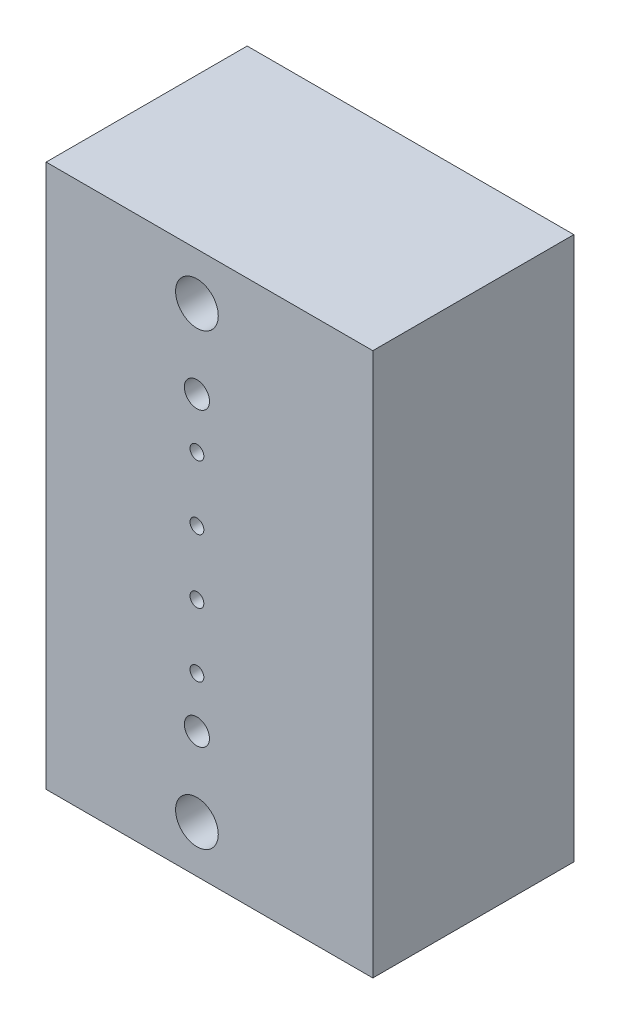
ISO-10303-21;
HEADER;
FILE_DESCRIPTION(('STEP AP214'),'2;1');
FILE_NAME('part.step','',(''),(''),'','','');
FILE_SCHEMA(('AUTOMOTIVE_DESIGN { 1 0 10303 214 1 1 1 1 }'));
ENDSEC;
DATA;
#1=APPLICATION_CONTEXT('core data for automotive mechanical design processes');
#2=APPLICATION_PROTOCOL_DEFINITION('international standard','automotive_design',2000,#1);
#3=PRODUCT_CONTEXT('',#1,'mechanical');
#4=PRODUCT('Part','Part','',(#3));
#5=PRODUCT_RELATED_PRODUCT_CATEGORY('part','',(#4));
#6=PRODUCT_DEFINITION_FORMATION('','',#4);
#7=PRODUCT_DEFINITION_CONTEXT('part definition',#1,'design');
#8=PRODUCT_DEFINITION('design','',#6,#7);
#9=PRODUCT_DEFINITION_SHAPE('','',#8);
#10=(LENGTH_UNIT() NAMED_UNIT(*) SI_UNIT(.MILLI.,.METRE.));
#11=(NAMED_UNIT(*) PLANE_ANGLE_UNIT() SI_UNIT($,.RADIAN.));
#12=(NAMED_UNIT(*) SI_UNIT($,.STERADIAN.) SOLID_ANGLE_UNIT());
#13=UNCERTAINTY_MEASURE_WITH_UNIT(LENGTH_MEASURE(1.E-05),#10,'distance_accuracy_value','');
#14=(GEOMETRIC_REPRESENTATION_CONTEXT(3) GLOBAL_UNCERTAINTY_ASSIGNED_CONTEXT((#13)) GLOBAL_UNIT_ASSIGNED_CONTEXT((#10,
#11,#12)) REPRESENTATION_CONTEXT('',''));
#15=CARTESIAN_POINT('',(0.,0.,0.));
#16=DIRECTION('',(0.,0.,1.));
#17=DIRECTION('',(1.,0.,0.));
#18=AXIS2_PLACEMENT_3D('',#15,#16,#17);
#19=CARTESIAN_POINT('',(-4.,26.62,16.));
#20=DIRECTION('',(1.,0.,0.));
#21=DIRECTION('',(0.,0.,-1.));
#22=AXIS2_PLACEMENT_3D('',#19,#20,#21);
#23=PLANE('',#22);
#24=DIRECTION('',(0.,0.,-1.));
#25=VECTOR('',#24,1.);
#26=CARTESIAN_POINT('',(-4.,-5.12,4.));
#27=LINE('',#26,#25);
#28=CARTESIAN_POINT('',(-4.,-5.12,4.));
#29=VERTEX_POINT('',#28);
#30=CARTESIAN_POINT('',(-4.,-5.12,0.));
#31=VERTEX_POINT('',#30);
#32=EDGE_CURVE('E123',#29,#31,#27,.T.);
#33=ORIENTED_EDGE('',*,*,#32,.T.);
#34=DIRECTION('',(0.,-1.,0.));
#35=VECTOR('',#34,1.);
#36=CARTESIAN_POINT('',(-4.,26.62,0.));
#37=LINE('',#36,#35);
#38=CARTESIAN_POINT('',(-4.,-16.62,0.));
#39=VERTEX_POINT('',#38);
#40=EDGE_CURVE('E189',#31,#39,#37,.T.);
#41=ORIENTED_EDGE('',*,*,#40,.T.);
#42=DIRECTION('',(0.,0.,-1.));
#43=VECTOR('',#42,1.);
#44=CARTESIAN_POINT('',(-4.,-16.62,16.));
#45=LINE('',#44,#43);
#46=CARTESIAN_POINT('',(-4.,-16.62,16.));
#47=VERTEX_POINT('',#46);
#48=EDGE_CURVE('E11',#47,#39,#45,.T.);
#49=ORIENTED_EDGE('',*,*,#48,.F.);
#50=DIRECTION('',(0.,-1.,0.));
#51=VECTOR('',#50,1.);
#52=CARTESIAN_POINT('',(-4.,26.62,16.));
#53=LINE('',#52,#51);
#54=CARTESIAN_POINT('',(-4.,26.62,16.));
#55=VERTEX_POINT('',#54);
#56=EDGE_CURVE('E179',#55,#47,#53,.T.);
#57=ORIENTED_EDGE('',*,*,#56,.F.);
#58=DIRECTION('',(0.,0.,-1.));
#59=VECTOR('',#58,1.);
#60=CARTESIAN_POINT('',(-4.,26.62,16.));
#61=LINE('',#60,#59);
#62=CARTESIAN_POINT('',(-4.,26.62,0.));
#63=VERTEX_POINT('',#62);
#64=EDGE_CURVE('E185',#55,#63,#61,.T.);
#65=ORIENTED_EDGE('',*,*,#64,.T.);
#66=CARTESIAN_POINT('',(-4.,15.12,0.));
#67=VERTEX_POINT('',#66);
#68=EDGE_CURVE('E186',#63,#67,#37,.T.);
#69=ORIENTED_EDGE('',*,*,#68,.T.);
#70=DIRECTION('',(0.,0.,-1.));
#71=VECTOR('',#70,1.);
#72=CARTESIAN_POINT('',(-4.,15.12,4.));
#73=LINE('',#72,#71);
#74=CARTESIAN_POINT('',(-4.,15.12,4.));
#75=VERTEX_POINT('',#74);
#76=EDGE_CURVE('E51',#75,#67,#73,.T.);
#77=ORIENTED_EDGE('',*,*,#76,.F.);
#78=DIRECTION('',(0.,-1.,0.));
#79=VECTOR('',#78,1.);
#80=CARTESIAN_POINT('',(-4.,15.12,4.));
#81=LINE('',#80,#79);
#82=EDGE_CURVE('E117',#75,#29,#81,.T.);
#83=ORIENTED_EDGE('',*,*,#82,.T.);
#84=EDGE_LOOP('',(#33,#41,#49,#57,#65,#69,#77,#83));
#85=FACE_BOUND('',#84,.T.);
#86=ADVANCED_FACE('F35',(#85),#23,.F.);
#87=CARTESIAN_POINT('',(0.,0.,0.));
#88=DIRECTION('',(0.,0.,1.));
#89=DIRECTION('',(1.,0.,0.));
#90=AXIS2_PLACEMENT_3D('',#87,#88,#89);
#91=PLANE('',#90);
#92=CARTESIAN_POINT('',(8.,-12.87,0.));
#93=DIRECTION('',(0.,0.,1.));
#94=DIRECTION('',(1.,0.,0.));
#95=AXIS2_PLACEMENT_3D('',#92,#93,#94);
#96=CIRCLE('',#95,1.7);
#97=CARTESIAN_POINT('',(9.7,-12.87,0.));
#98=VERTEX_POINT('',#97);
#99=EDGE_CURVE('E178',#98,#98,#96,.T.);
#100=ORIENTED_EDGE('',*,*,#99,.T.);
#101=EDGE_LOOP('',(#100));
#102=FACE_BOUND('',#101,.T.);
#103=CARTESIAN_POINT('',(8.,22.87,0.));
#104=DIRECTION('',(0.,0.,1.));
#105=DIRECTION('',(1.,0.,0.));
#106=AXIS2_PLACEMENT_3D('',#103,#104,#105);
#107=CIRCLE('',#106,1.7);
#108=CARTESIAN_POINT('',(9.7,22.87,0.));
#109=VERTEX_POINT('',#108);
#110=EDGE_CURVE('E200',#109,#109,#107,.T.);
#111=ORIENTED_EDGE('',*,*,#110,.T.);
#112=EDGE_LOOP('',(#111));
#113=FACE_BOUND('',#112,.T.);
#114=DIRECTION('',(1.,0.,0.));
#115=VECTOR('',#114,1.);
#116=CARTESIAN_POINT('',(-4.,-5.12,0.));
#117=LINE('',#116,#115);
#118=CARTESIAN_POINT('',(10.5,-5.12,0.));
#119=VERTEX_POINT('',#118);
#120=EDGE_CURVE('E126',#31,#119,#117,.T.);
#121=ORIENTED_EDGE('',*,*,#120,.T.);
#122=DIRECTION('',(0.,1.,0.));
#123=VECTOR('',#122,1.);
#124=CARTESIAN_POINT('',(10.5,-5.12,0.));
#125=LINE('',#124,#123);
#126=CARTESIAN_POINT('',(10.5,15.12,0.));
#127=VERTEX_POINT('',#126);
#128=EDGE_CURVE('E134',#119,#127,#125,.T.);
#129=ORIENTED_EDGE('',*,*,#128,.T.);
#130=DIRECTION('',(-1.,0.,0.));
#131=VECTOR('',#130,1.);
#132=CARTESIAN_POINT('',(10.5,15.12,0.));
#133=LINE('',#132,#131);
#134=EDGE_CURVE('E132',#127,#67,#133,.T.);
#135=ORIENTED_EDGE('',*,*,#134,.T.);
#136=ORIENTED_EDGE('',*,*,#68,.F.);
#137=DIRECTION('',(-1.,0.,0.));
#138=VECTOR('',#137,1.);
#139=CARTESIAN_POINT('',(22.,26.62,0.));
#140=LINE('',#139,#138);
#141=CARTESIAN_POINT('',(22.,26.62,0.));
#142=VERTEX_POINT('',#141);
#143=EDGE_CURVE('E81',#142,#63,#140,.T.);
#144=ORIENTED_EDGE('',*,*,#143,.F.);
#145=DIRECTION('',(0.,1.,0.));
#146=VECTOR('',#145,1.);
#147=CARTESIAN_POINT('',(22.,-16.62,0.));
#148=LINE('',#147,#146);
#149=CARTESIAN_POINT('',(22.,-16.62,0.));
#150=VERTEX_POINT('',#149);
#151=EDGE_CURVE('E191',#150,#142,#148,.T.);
#152=ORIENTED_EDGE('',*,*,#151,.F.);
#153=DIRECTION('',(1.,0.,0.));
#154=VECTOR('',#153,1.);
#155=CARTESIAN_POINT('',(-4.,-16.62,0.));
#156=LINE('',#155,#154);
#157=EDGE_CURVE('E188',#39,#150,#156,.T.);
#158=ORIENTED_EDGE('',*,*,#157,.F.);
#159=ORIENTED_EDGE('',*,*,#40,.F.);
#160=EDGE_LOOP('',(#121,#129,#135,#136,#144,#152,#158,#159));
#161=FACE_BOUND('',#160,.T.);
#162=ADVANCED_FACE('F209',(#102,#113,#161),#91,.F.);
#163=CARTESIAN_POINT('',(-4.,-16.62,16.));
#164=DIRECTION('',(0.,1.,0.));
#165=DIRECTION('',(0.,0.,1.));
#166=AXIS2_PLACEMENT_3D('',#163,#164,#165);
#167=PLANE('',#166);
#168=ORIENTED_EDGE('',*,*,#157,.T.);
#169=DIRECTION('',(0.,0.,-1.));
#170=VECTOR('',#169,1.);
#171=CARTESIAN_POINT('',(22.,-16.62,16.));
#172=LINE('',#171,#170);
#173=CARTESIAN_POINT('',(22.,-16.62,16.));
#174=VERTEX_POINT('',#173);
#175=EDGE_CURVE('E43',#174,#150,#172,.T.);
#176=ORIENTED_EDGE('',*,*,#175,.F.);
#177=DIRECTION('',(1.,0.,0.));
#178=VECTOR('',#177,1.);
#179=CARTESIAN_POINT('',(-4.,-16.62,16.));
#180=LINE('',#179,#178);
#181=EDGE_CURVE('E88',#47,#174,#180,.T.);
#182=ORIENTED_EDGE('',*,*,#181,.F.);
#183=ORIENTED_EDGE('',*,*,#48,.T.);
#184=EDGE_LOOP('',(#168,#176,#182,#183));
#185=FACE_BOUND('',#184,.T.);
#186=ADVANCED_FACE('F210',(#185),#167,.F.);
#187=CARTESIAN_POINT('',(22.,-16.62,16.));
#188=DIRECTION('',(-1.,0.,0.));
#189=DIRECTION('',(0.,0.,1.));
#190=AXIS2_PLACEMENT_3D('',#187,#188,#189);
#191=PLANE('',#190);
#192=ORIENTED_EDGE('',*,*,#151,.T.);
#193=DIRECTION('',(0.,0.,-1.));
#194=VECTOR('',#193,1.);
#195=CARTESIAN_POINT('',(22.,26.62,16.));
#196=LINE('',#195,#194);
#197=CARTESIAN_POINT('',(22.,26.62,16.));
#198=VERTEX_POINT('',#197);
#199=EDGE_CURVE('E195',#198,#142,#196,.T.);
#200=ORIENTED_EDGE('',*,*,#199,.F.);
#201=DIRECTION('',(0.,1.,0.));
#202=VECTOR('',#201,1.);
#203=CARTESIAN_POINT('',(22.,-16.62,16.));
#204=LINE('',#203,#202);
#205=EDGE_CURVE('E182',#174,#198,#204,.T.);
#206=ORIENTED_EDGE('',*,*,#205,.F.);
#207=ORIENTED_EDGE('',*,*,#175,.T.);
#208=EDGE_LOOP('',(#192,#200,#206,#207));
#209=FACE_BOUND('',#208,.T.);
#210=ADVANCED_FACE('F212',(#209),#191,.F.);
#211=CARTESIAN_POINT('',(22.,26.62,16.));
#212=DIRECTION('',(0.,-1.,0.));
#213=DIRECTION('',(0.,0.,-1.));
#214=AXIS2_PLACEMENT_3D('',#211,#212,#213);
#215=PLANE('',#214);
#216=ORIENTED_EDGE('',*,*,#143,.T.);
#217=ORIENTED_EDGE('',*,*,#64,.F.);
#218=DIRECTION('',(-1.,0.,0.));
#219=VECTOR('',#218,1.);
#220=CARTESIAN_POINT('',(22.,26.62,16.));
#221=LINE('',#220,#219);
#222=EDGE_CURVE('E60',#198,#55,#221,.T.);
#223=ORIENTED_EDGE('',*,*,#222,.F.);
#224=ORIENTED_EDGE('',*,*,#199,.T.);
#225=EDGE_LOOP('',(#216,#217,#223,#224));
#226=FACE_BOUND('',#225,.T.);
#227=ADVANCED_FACE('F217',(#226),#215,.F.);
#228=CARTESIAN_POINT('',(0.,0.,16.));
#229=DIRECTION('',(0.,0.,1.));
#230=DIRECTION('',(1.,0.,0.));
#231=AXIS2_PLACEMENT_3D('',#228,#229,#230);
#232=PLANE('',#231);
#233=CARTESIAN_POINT('',(8.,-6.62,16.));
#234=DIRECTION('',(0.,0.,1.));
#235=DIRECTION('',(1.,0.,0.));
#236=AXIS2_PLACEMENT_3D('',#233,#234,#235);
#237=CIRCLE('',#236,1.);
#238=CARTESIAN_POINT('',(9.,-6.62,16.));
#239=VERTEX_POINT('',#238);
#240=EDGE_CURVE('E423',#239,#239,#237,.T.);
#241=ORIENTED_EDGE('',*,*,#240,.F.);
#242=EDGE_LOOP('',(#241));
#243=FACE_BOUND('',#242,.T.);
#244=CARTESIAN_POINT('',(8.,16.62,16.));
#245=DIRECTION('',(0.,0.,1.));
#246=DIRECTION('',(1.,0.,0.));
#247=AXIS2_PLACEMENT_3D('',#244,#245,#246);
#248=CIRCLE('',#247,1.);
#249=CARTESIAN_POINT('',(9.,16.62,16.));
#250=VERTEX_POINT('',#249);
#251=EDGE_CURVE('E137',#250,#250,#248,.T.);
#252=ORIENTED_EDGE('',*,*,#251,.F.);
#253=EDGE_LOOP('',(#252));
#254=FACE_BOUND('',#253,.T.);
#255=CARTESIAN_POINT('',(8.,22.87,16.));
#256=DIRECTION('',(0.,0.,1.));
#257=DIRECTION('',(1.,0.,0.));
#258=AXIS2_PLACEMENT_3D('',#255,#256,#257);
#259=CIRCLE('',#258,1.7);
#260=CARTESIAN_POINT('',(9.7,22.87,16.));
#261=VERTEX_POINT('',#260);
#262=EDGE_CURVE('E160',#261,#261,#259,.T.);
#263=ORIENTED_EDGE('',*,*,#262,.F.);
#264=EDGE_LOOP('',(#263));
#265=FACE_BOUND('',#264,.T.);
#266=CARTESIAN_POINT('',(8.,2.46,16.));
#267=DIRECTION('',(0.,0.,1.));
#268=DIRECTION('',(1.,0.,0.));
#269=AXIS2_PLACEMENT_3D('',#266,#267,#268);
#270=CIRCLE('',#269,0.55);
#271=CARTESIAN_POINT('',(8.55,2.46,16.));
#272=VERTEX_POINT('',#271);
#273=EDGE_CURVE('E168',#272,#272,#270,.T.);
#274=ORIENTED_EDGE('',*,*,#273,.F.);
#275=EDGE_LOOP('',(#274));
#276=FACE_BOUND('',#275,.T.);
#277=CARTESIAN_POINT('',(8.,7.54,16.));
#278=DIRECTION('',(0.,0.,1.));
#279=DIRECTION('',(1.,0.,0.));
#280=AXIS2_PLACEMENT_3D('',#277,#278,#279);
#281=CIRCLE('',#280,0.55);
#282=CARTESIAN_POINT('',(8.55,7.54,16.));
#283=VERTEX_POINT('',#282);
#284=EDGE_CURVE('E164',#283,#283,#281,.T.);
#285=ORIENTED_EDGE('',*,*,#284,.F.);
#286=EDGE_LOOP('',(#285));
#287=FACE_BOUND('',#286,.T.);
#288=CARTESIAN_POINT('',(8.,12.62,16.));
#289=DIRECTION('',(0.,0.,1.));
#290=DIRECTION('',(1.,0.,0.));
#291=AXIS2_PLACEMENT_3D('',#288,#289,#290);
#292=CIRCLE('',#291,0.55);
#293=CARTESIAN_POINT('',(8.55,12.62,16.));
#294=VERTEX_POINT('',#293);
#295=EDGE_CURVE('E161',#294,#294,#292,.T.);
#296=ORIENTED_EDGE('',*,*,#295,.F.);
#297=EDGE_LOOP('',(#296));
#298=FACE_BOUND('',#297,.T.);
#299=CARTESIAN_POINT('',(8.,-12.87,16.));
#300=DIRECTION('',(0.,0.,1.));
#301=DIRECTION('',(1.,0.,0.));
#302=AXIS2_PLACEMENT_3D('',#299,#300,#301);
#303=CIRCLE('',#302,1.7);
#304=CARTESIAN_POINT('',(9.7,-12.87,16.));
#305=VERTEX_POINT('',#304);
#306=EDGE_CURVE('E165',#305,#305,#303,.T.);
#307=ORIENTED_EDGE('',*,*,#306,.F.);
#308=EDGE_LOOP('',(#307));
#309=FACE_BOUND('',#308,.T.);
#310=CARTESIAN_POINT('',(8.,-2.62,16.));
#311=DIRECTION('',(0.,0.,1.));
#312=DIRECTION('',(1.,0.,0.));
#313=AXIS2_PLACEMENT_3D('',#310,#311,#312);
#314=CIRCLE('',#313,0.55);
#315=CARTESIAN_POINT('',(8.55,-2.62,16.));
#316=VERTEX_POINT('',#315);
#317=EDGE_CURVE('E171',#316,#316,#314,.T.);
#318=ORIENTED_EDGE('',*,*,#317,.F.);
#319=EDGE_LOOP('',(#318));
#320=FACE_BOUND('',#319,.T.);
#321=ORIENTED_EDGE('',*,*,#56,.T.);
#322=ORIENTED_EDGE('',*,*,#181,.T.);
#323=ORIENTED_EDGE('',*,*,#205,.T.);
#324=ORIENTED_EDGE('',*,*,#222,.T.);
#325=EDGE_LOOP('',(#321,#322,#323,#324));
#326=FACE_BOUND('',#325,.T.);
#327=ADVANCED_FACE('F242',(#243,#254,#265,#276,#287,#298,#309,#320,#326),#232,.T.);
#328=CARTESIAN_POINT('',(8.,-2.62,-1.2E-05));
#329=DIRECTION('',(0.,0.,1.));
#330=DIRECTION('',(1.,0.,0.));
#331=AXIS2_PLACEMENT_3D('',#328,#329,#330);
#332=CYLINDRICAL_SURFACE('',#331,0.55);
#333=CARTESIAN_POINT('',(8.,-2.62,4.));
#334=DIRECTION('',(0.,0.,1.));
#335=DIRECTION('',(1.,0.,0.));
#336=AXIS2_PLACEMENT_3D('',#333,#334,#335);
#337=CIRCLE('',#336,0.55);
#338=CARTESIAN_POINT('',(8.55,-2.62,4.));
#339=VERTEX_POINT('',#338);
#340=EDGE_CURVE('E157',#339,#339,#337,.F.);
#341=ORIENTED_EDGE('',*,*,#340,.T.);
#342=EDGE_LOOP('',(#341));
#343=FACE_BOUND('',#342,.T.);
#344=ORIENTED_EDGE('',*,*,#317,.T.);
#345=EDGE_LOOP('',(#344));
#346=FACE_BOUND('',#345,.T.);
#347=ADVANCED_FACE('F236',(#343,#346),#332,.F.);
#348=CARTESIAN_POINT('',(8.,-12.87,-1.2E-05));
#349=DIRECTION('',(0.,0.,1.));
#350=DIRECTION('',(1.,0.,0.));
#351=AXIS2_PLACEMENT_3D('',#348,#349,#350);
#352=CYLINDRICAL_SURFACE('',#351,1.7);
#353=CARTESIAN_POINT('',(9.7,-12.87,16.));
#354=CARTESIAN_POINT('',(9.7,-12.87,15.8333333333333));
#355=CARTESIAN_POINT('',(9.7,-12.87,15.6666666666667));
#356=CARTESIAN_POINT('',(9.7,-12.87,15.3333333333333));
#357=CARTESIAN_POINT('',(9.7,-12.87,15.1666666666667));
#358=CARTESIAN_POINT('',(9.7,-12.87,14.8333333333333));
#359=CARTESIAN_POINT('',(9.7,-12.87,14.6666666666667));
#360=CARTESIAN_POINT('',(9.7,-12.87,14.3333333333333));
#361=CARTESIAN_POINT('',(9.7,-12.87,14.1666666666667));
#362=CARTESIAN_POINT('',(9.7,-12.87,13.8333333333333));
#363=CARTESIAN_POINT('',(9.7,-12.87,13.6666666666667));
#364=CARTESIAN_POINT('',(9.7,-12.87,13.3333333333333));
#365=CARTESIAN_POINT('',(9.7,-12.87,13.1666666666667));
#366=CARTESIAN_POINT('',(9.7,-12.87,12.8333333333333));
#367=CARTESIAN_POINT('',(9.7,-12.87,12.6666666666667));
#368=CARTESIAN_POINT('',(9.7,-12.87,12.3333333333333));
#369=CARTESIAN_POINT('',(9.7,-12.87,12.1666666666667));
#370=CARTESIAN_POINT('',(9.7,-12.87,11.8333333333333));
#371=CARTESIAN_POINT('',(9.7,-12.87,11.6666666666667));
#372=CARTESIAN_POINT('',(9.7,-12.87,11.3333333333333));
#373=CARTESIAN_POINT('',(9.7,-12.87,11.1666666666667));
#374=CARTESIAN_POINT('',(9.7,-12.87,10.8333333333333));
#375=CARTESIAN_POINT('',(9.7,-12.87,10.6666666666667));
#376=CARTESIAN_POINT('',(9.7,-12.87,10.3333333333333));
#377=CARTESIAN_POINT('',(9.7,-12.87,10.1666666666667));
#378=CARTESIAN_POINT('',(9.7,-12.87,9.83333333333333));
#379=CARTESIAN_POINT('',(9.7,-12.87,9.66666666666667));
#380=CARTESIAN_POINT('',(9.7,-12.87,9.33333333333333));
#381=CARTESIAN_POINT('',(9.7,-12.87,9.16666666666666));
#382=CARTESIAN_POINT('',(9.7,-12.87,8.83333333333333));
#383=CARTESIAN_POINT('',(9.7,-12.87,8.66666666666667));
#384=CARTESIAN_POINT('',(9.7,-12.87,8.33333333333333));
#385=CARTESIAN_POINT('',(9.7,-12.87,8.16666666666667));
#386=CARTESIAN_POINT('',(9.7,-12.87,7.83333333333333));
#387=CARTESIAN_POINT('',(9.7,-12.87,7.66666666666667));
#388=CARTESIAN_POINT('',(9.7,-12.87,7.33333333333333));
#389=CARTESIAN_POINT('',(9.7,-12.87,7.16666666666667));
#390=CARTESIAN_POINT('',(9.7,-12.87,6.83333333333333));
#391=CARTESIAN_POINT('',(9.7,-12.87,6.66666666666667));
#392=CARTESIAN_POINT('',(9.7,-12.87,6.33333333333333));
#393=CARTESIAN_POINT('',(9.7,-12.87,6.16666666666667));
#394=CARTESIAN_POINT('',(9.7,-12.87,5.83333333333333));
#395=CARTESIAN_POINT('',(9.7,-12.87,5.66666666666667));
#396=CARTESIAN_POINT('',(9.7,-12.87,5.33333333333333));
#397=CARTESIAN_POINT('',(9.7,-12.87,5.16666666666667));
#398=CARTESIAN_POINT('',(9.7,-12.87,4.83333333333333));
#399=CARTESIAN_POINT('',(9.7,-12.87,4.66666666666667));
#400=CARTESIAN_POINT('',(9.7,-12.87,4.33333333333333));
#401=CARTESIAN_POINT('',(9.7,-12.87,4.16666666666667));
#402=CARTESIAN_POINT('',(9.7,-12.87,3.83333333333333));
#403=CARTESIAN_POINT('',(9.7,-12.87,3.66666666666667));
#404=CARTESIAN_POINT('',(9.7,-12.87,3.33333333333333));
#405=CARTESIAN_POINT('',(9.7,-12.87,3.16666666666667));
#406=CARTESIAN_POINT('',(9.7,-12.87,2.83333333333333));
#407=CARTESIAN_POINT('',(9.7,-12.87,2.66666666666667));
#408=CARTESIAN_POINT('',(9.7,-12.87,2.33333333333333));
#409=CARTESIAN_POINT('',(9.7,-12.87,2.16666666666667));
#410=CARTESIAN_POINT('',(9.7,-12.87,1.83333333333333));
#411=CARTESIAN_POINT('',(9.7,-12.87,1.66666666666667));
#412=CARTESIAN_POINT('',(9.7,-12.87,1.33333333333333));
#413=CARTESIAN_POINT('',(9.7,-12.87,1.16666666666667));
#414=CARTESIAN_POINT('',(9.7,-12.87,0.833333333333335));
#415=CARTESIAN_POINT('',(9.7,-12.87,0.666666666666668));
#416=CARTESIAN_POINT('',(9.7,-12.87,0.333333333333334));
#417=CARTESIAN_POINT('',(9.7,-12.87,0.166666666666667));
#418=CARTESIAN_POINT('',(9.7,-12.87,0.));
#419=B_SPLINE_CURVE_WITH_KNOTS('',3,(#353,#354,#355,#356,#357,#358,#359,#360,#361,#362,#363,
#364,#365,#366,#367,#368,#369,#370,#371,#372,#373,#374,#375,#376,#377,#378,#379,#380,#381,#382,
#383,#384,#385,#386,#387,#388,#389,#390,#391,#392,#393,#394,#395,#396,#397,#398,#399,#400,#401,
#402,#403,#404,#405,#406,#407,#408,#409,#410,#411,#412,#413,#414,#415,#416,#417,#418),
.UNSPECIFIED.,.F.,.F.,(4,2,2,2,2,2,2,2,2,2,2,2,2,2,2,2,2,2,2,2,2,2,2,2,2,2,2,2,2,2,2,2,4),(0.,
0.499999999999999,0.999999999999999,1.5,2.,2.5,3.,3.5,4.,4.5,5.,5.5,6.,6.5,7.,7.5,8.,8.5,9.,9.5,
10.,10.5,11.,11.5,12.,12.5,13.,13.5,14.,14.5,15.,15.5,16.),.UNSPECIFIED.);
#420=EDGE_CURVE('BSEAM241',#305,#98,#419,.T.);
#421=ORIENTED_EDGE('',*,*,#306,.T.);
#422=ORIENTED_EDGE('',*,*,#99,.F.);
#423=ORIENTED_EDGE('',*,*,#420,.T.);
#424=ORIENTED_EDGE('',*,*,#420,.F.);
#425=EDGE_LOOP('',(#421,#423,#422,#424));
#426=FACE_BOUND('',#425,.T.);
#427=ADVANCED_FACE('F241',(#426),#352,.F.);
#428=CARTESIAN_POINT('',(8.,12.62,-1.2E-05));
#429=DIRECTION('',(0.,0.,1.));
#430=DIRECTION('',(1.,0.,0.));
#431=AXIS2_PLACEMENT_3D('',#428,#429,#430);
#432=CYLINDRICAL_SURFACE('',#431,0.55);
#433=CARTESIAN_POINT('',(8.,12.62,4.));
#434=DIRECTION('',(0.,0.,1.));
#435=DIRECTION('',(1.,0.,0.));
#436=AXIS2_PLACEMENT_3D('',#433,#434,#435);
#437=CIRCLE('',#436,0.55);
#438=CARTESIAN_POINT('',(8.55,12.62,4.));
#439=VERTEX_POINT('',#438);
#440=EDGE_CURVE('E154',#439,#439,#437,.F.);
#441=ORIENTED_EDGE('',*,*,#440,.T.);
#442=EDGE_LOOP('',(#441));
#443=FACE_BOUND('',#442,.T.);
#444=ORIENTED_EDGE('',*,*,#295,.T.);
#445=EDGE_LOOP('',(#444));
#446=FACE_BOUND('',#445,.T.);
#447=ADVANCED_FACE('F252',(#443,#446),#432,.F.);
#448=CARTESIAN_POINT('',(8.,7.54,-1.2E-05));
#449=DIRECTION('',(0.,0.,1.));
#450=DIRECTION('',(1.,0.,0.));
#451=AXIS2_PLACEMENT_3D('',#448,#449,#450);
#452=CYLINDRICAL_SURFACE('',#451,0.55);
#453=CARTESIAN_POINT('',(8.,7.54,4.));
#454=DIRECTION('',(0.,0.,1.));
#455=DIRECTION('',(1.,0.,0.));
#456=AXIS2_PLACEMENT_3D('',#453,#454,#455);
#457=CIRCLE('',#456,0.55);
#458=CARTESIAN_POINT('',(8.55,7.54,4.));
#459=VERTEX_POINT('',#458);
#460=EDGE_CURVE('E151',#459,#459,#457,.F.);
#461=ORIENTED_EDGE('',*,*,#460,.T.);
#462=EDGE_LOOP('',(#461));
#463=FACE_BOUND('',#462,.T.);
#464=ORIENTED_EDGE('',*,*,#284,.T.);
#465=EDGE_LOOP('',(#464));
#466=FACE_BOUND('',#465,.T.);
#467=ADVANCED_FACE('F257',(#463,#466),#452,.F.);
#468=CARTESIAN_POINT('',(8.,2.46,-1.2E-05));
#469=DIRECTION('',(0.,0.,1.));
#470=DIRECTION('',(1.,0.,0.));
#471=AXIS2_PLACEMENT_3D('',#468,#469,#470);
#472=CYLINDRICAL_SURFACE('',#471,0.55);
#473=CARTESIAN_POINT('',(8.,2.46,4.));
#474=DIRECTION('',(0.,0.,1.));
#475=DIRECTION('',(1.,0.,0.));
#476=AXIS2_PLACEMENT_3D('',#473,#474,#475);
#477=CIRCLE('',#476,0.55);
#478=CARTESIAN_POINT('',(8.55,2.46,4.));
#479=VERTEX_POINT('',#478);
#480=EDGE_CURVE('E38',#479,#479,#477,.F.);
#481=ORIENTED_EDGE('',*,*,#480,.T.);
#482=EDGE_LOOP('',(#481));
#483=FACE_BOUND('',#482,.T.);
#484=ORIENTED_EDGE('',*,*,#273,.T.);
#485=EDGE_LOOP('',(#484));
#486=FACE_BOUND('',#485,.T.);
#487=ADVANCED_FACE('F267',(#483,#486),#472,.F.);
#488=CARTESIAN_POINT('',(8.,22.87,-1.2E-05));
#489=DIRECTION('',(0.,0.,1.));
#490=DIRECTION('',(1.,0.,0.));
#491=AXIS2_PLACEMENT_3D('',#488,#489,#490);
#492=CYLINDRICAL_SURFACE('',#491,1.7);
#493=CARTESIAN_POINT('',(9.7,22.87,16.));
#494=CARTESIAN_POINT('',(9.7,22.87,15.8333333333333));
#495=CARTESIAN_POINT('',(9.7,22.87,15.6666666666667));
#496=CARTESIAN_POINT('',(9.7,22.87,15.3333333333333));
#497=CARTESIAN_POINT('',(9.7,22.87,15.1666666666667));
#498=CARTESIAN_POINT('',(9.7,22.87,14.8333333333333));
#499=CARTESIAN_POINT('',(9.7,22.87,14.6666666666667));
#500=CARTESIAN_POINT('',(9.7,22.87,14.3333333333333));
#501=CARTESIAN_POINT('',(9.7,22.87,14.1666666666667));
#502=CARTESIAN_POINT('',(9.7,22.87,13.8333333333333));
#503=CARTESIAN_POINT('',(9.7,22.87,13.6666666666667));
#504=CARTESIAN_POINT('',(9.7,22.87,13.3333333333333));
#505=CARTESIAN_POINT('',(9.7,22.87,13.1666666666667));
#506=CARTESIAN_POINT('',(9.7,22.87,12.8333333333333));
#507=CARTESIAN_POINT('',(9.7,22.87,12.6666666666667));
#508=CARTESIAN_POINT('',(9.7,22.87,12.3333333333333));
#509=CARTESIAN_POINT('',(9.7,22.87,12.1666666666667));
#510=CARTESIAN_POINT('',(9.7,22.87,11.8333333333333));
#511=CARTESIAN_POINT('',(9.7,22.87,11.6666666666667));
#512=CARTESIAN_POINT('',(9.7,22.87,11.3333333333333));
#513=CARTESIAN_POINT('',(9.7,22.87,11.1666666666667));
#514=CARTESIAN_POINT('',(9.7,22.87,10.8333333333333));
#515=CARTESIAN_POINT('',(9.7,22.87,10.6666666666667));
#516=CARTESIAN_POINT('',(9.7,22.87,10.3333333333333));
#517=CARTESIAN_POINT('',(9.7,22.87,10.1666666666667));
#518=CARTESIAN_POINT('',(9.7,22.87,9.83333333333333));
#519=CARTESIAN_POINT('',(9.7,22.87,9.66666666666667));
#520=CARTESIAN_POINT('',(9.7,22.87,9.33333333333333));
#521=CARTESIAN_POINT('',(9.7,22.87,9.16666666666666));
#522=CARTESIAN_POINT('',(9.7,22.87,8.83333333333333));
#523=CARTESIAN_POINT('',(9.7,22.87,8.66666666666667));
#524=CARTESIAN_POINT('',(9.7,22.87,8.33333333333333));
#525=CARTESIAN_POINT('',(9.7,22.87,8.16666666666667));
#526=CARTESIAN_POINT('',(9.7,22.87,7.83333333333333));
#527=CARTESIAN_POINT('',(9.7,22.87,7.66666666666667));
#528=CARTESIAN_POINT('',(9.7,22.87,7.33333333333333));
#529=CARTESIAN_POINT('',(9.7,22.87,7.16666666666667));
#530=CARTESIAN_POINT('',(9.7,22.87,6.83333333333333));
#531=CARTESIAN_POINT('',(9.7,22.87,6.66666666666667));
#532=CARTESIAN_POINT('',(9.7,22.87,6.33333333333333));
#533=CARTESIAN_POINT('',(9.7,22.87,6.16666666666667));
#534=CARTESIAN_POINT('',(9.7,22.87,5.83333333333333));
#535=CARTESIAN_POINT('',(9.7,22.87,5.66666666666667));
#536=CARTESIAN_POINT('',(9.7,22.87,5.33333333333333));
#537=CARTESIAN_POINT('',(9.7,22.87,5.16666666666667));
#538=CARTESIAN_POINT('',(9.7,22.87,4.83333333333333));
#539=CARTESIAN_POINT('',(9.7,22.87,4.66666666666667));
#540=CARTESIAN_POINT('',(9.7,22.87,4.33333333333333));
#541=CARTESIAN_POINT('',(9.7,22.87,4.16666666666667));
#542=CARTESIAN_POINT('',(9.7,22.87,3.83333333333333));
#543=CARTESIAN_POINT('',(9.7,22.87,3.66666666666667));
#544=CARTESIAN_POINT('',(9.7,22.87,3.33333333333333));
#545=CARTESIAN_POINT('',(9.7,22.87,3.16666666666667));
#546=CARTESIAN_POINT('',(9.7,22.87,2.83333333333333));
#547=CARTESIAN_POINT('',(9.7,22.87,2.66666666666667));
#548=CARTESIAN_POINT('',(9.7,22.87,2.33333333333333));
#549=CARTESIAN_POINT('',(9.7,22.87,2.16666666666667));
#550=CARTESIAN_POINT('',(9.7,22.87,1.83333333333333));
#551=CARTESIAN_POINT('',(9.7,22.87,1.66666666666667));
#552=CARTESIAN_POINT('',(9.7,22.87,1.33333333333333));
#553=CARTESIAN_POINT('',(9.7,22.87,1.16666666666667));
#554=CARTESIAN_POINT('',(9.7,22.87,0.833333333333335));
#555=CARTESIAN_POINT('',(9.7,22.87,0.666666666666668));
#556=CARTESIAN_POINT('',(9.7,22.87,0.333333333333334));
#557=CARTESIAN_POINT('',(9.7,22.87,0.166666666666667));
#558=CARTESIAN_POINT('',(9.7,22.87,0.));
#559=B_SPLINE_CURVE_WITH_KNOTS('',3,(#493,#494,#495,#496,#497,#498,#499,#500,#501,#502,#503,
#504,#505,#506,#507,#508,#509,#510,#511,#512,#513,#514,#515,#516,#517,#518,#519,#520,#521,#522,
#523,#524,#525,#526,#527,#528,#529,#530,#531,#532,#533,#534,#535,#536,#537,#538,#539,#540,#541,
#542,#543,#544,#545,#546,#547,#548,#549,#550,#551,#552,#553,#554,#555,#556,#557,#558),
.UNSPECIFIED.,.F.,.F.,(4,2,2,2,2,2,2,2,2,2,2,2,2,2,2,2,2,2,2,2,2,2,2,2,2,2,2,2,2,2,2,2,4),(0.,
0.499999999999999,0.999999999999999,1.5,2.,2.5,3.,3.5,4.,4.5,5.,5.5,6.,6.5,7.,7.5,8.,8.5,9.,9.5,
10.,10.5,11.,11.5,12.,12.5,13.,13.5,14.,14.5,15.,15.5,16.),.UNSPECIFIED.);
#560=EDGE_CURVE('BSEAM277',#261,#109,#559,.T.);
#561=ORIENTED_EDGE('',*,*,#262,.T.);
#562=ORIENTED_EDGE('',*,*,#110,.F.);
#563=ORIENTED_EDGE('',*,*,#560,.T.);
#564=ORIENTED_EDGE('',*,*,#560,.F.);
#565=EDGE_LOOP('',(#561,#563,#562,#564));
#566=FACE_BOUND('',#565,.T.);
#567=ADVANCED_FACE('F277',(#566),#492,.F.);
#568=CARTESIAN_POINT('',(0.,0.,4.));
#569=DIRECTION('',(0.,0.,1.));
#570=DIRECTION('',(1.,0.,0.));
#571=AXIS2_PLACEMENT_3D('',#568,#569,#570);
#572=PLANE('',#571);
#573=ORIENTED_EDGE('',*,*,#440,.F.);
#574=EDGE_LOOP('',(#573));
#575=FACE_BOUND('',#574,.T.);
#576=ORIENTED_EDGE('',*,*,#480,.F.);
#577=EDGE_LOOP('',(#576));
#578=FACE_BOUND('',#577,.T.);
#579=ORIENTED_EDGE('',*,*,#82,.F.);
#580=DIRECTION('',(-1.,0.,0.));
#581=VECTOR('',#580,1.);
#582=CARTESIAN_POINT('',(10.5,15.12,4.));
#583=LINE('',#582,#581);
#584=CARTESIAN_POINT('',(10.5,15.12,4.));
#585=VERTEX_POINT('',#584);
#586=EDGE_CURVE('E141',#585,#75,#583,.T.);
#587=ORIENTED_EDGE('',*,*,#586,.F.);
#588=DIRECTION('',(0.,1.,0.));
#589=VECTOR('',#588,1.);
#590=CARTESIAN_POINT('',(10.5,-5.12,4.));
#591=LINE('',#590,#589);
#592=CARTESIAN_POINT('',(10.5,-5.12,4.));
#593=VERTEX_POINT('',#592);
#594=EDGE_CURVE('E118',#593,#585,#591,.T.);
#595=ORIENTED_EDGE('',*,*,#594,.F.);
#596=DIRECTION('',(1.,0.,0.));
#597=VECTOR('',#596,1.);
#598=CARTESIAN_POINT('',(-4.,-5.12,4.));
#599=LINE('',#598,#597);
#600=EDGE_CURVE('E111',#29,#593,#599,.T.);
#601=ORIENTED_EDGE('',*,*,#600,.F.);
#602=EDGE_LOOP('',(#579,#587,#595,#601));
#603=FACE_BOUND('',#602,.T.);
#604=ORIENTED_EDGE('',*,*,#460,.F.);
#605=EDGE_LOOP('',(#604));
#606=FACE_BOUND('',#605,.T.);
#607=ORIENTED_EDGE('',*,*,#340,.F.);
#608=EDGE_LOOP('',(#607));
#609=FACE_BOUND('',#608,.T.);
#610=ADVANCED_FACE('F113',(#575,#578,#603,#606,#609),#572,.F.);
#611=CARTESIAN_POINT('',(-4.,-5.12,4.));
#612=DIRECTION('',(0.,1.,0.));
#613=DIRECTION('',(0.,0.,1.));
#614=AXIS2_PLACEMENT_3D('',#611,#612,#613);
#615=PLANE('',#614);
#616=ORIENTED_EDGE('',*,*,#120,.F.);
#617=ORIENTED_EDGE('',*,*,#32,.F.);
#618=ORIENTED_EDGE('',*,*,#600,.T.);
#619=DIRECTION('',(0.,0.,-1.));
#620=VECTOR('',#619,1.);
#621=CARTESIAN_POINT('',(10.5,-5.12,4.));
#622=LINE('',#621,#620);
#623=EDGE_CURVE('E129',#593,#119,#622,.T.);
#624=ORIENTED_EDGE('',*,*,#623,.T.);
#625=EDGE_LOOP('',(#616,#617,#618,#624));
#626=FACE_BOUND('',#625,.T.);
#627=ADVANCED_FACE('F124',(#626),#615,.T.);
#628=CARTESIAN_POINT('',(10.5,-5.12,4.));
#629=DIRECTION('',(-1.,0.,0.));
#630=DIRECTION('',(0.,0.,1.));
#631=AXIS2_PLACEMENT_3D('',#628,#629,#630);
#632=PLANE('',#631);
#633=ORIENTED_EDGE('',*,*,#128,.F.);
#634=ORIENTED_EDGE('',*,*,#623,.F.);
#635=ORIENTED_EDGE('',*,*,#594,.T.);
#636=DIRECTION('',(0.,0.,-1.));
#637=VECTOR('',#636,1.);
#638=CARTESIAN_POINT('',(10.5,15.12,4.));
#639=LINE('',#638,#637);
#640=EDGE_CURVE('E148',#585,#127,#639,.T.);
#641=ORIENTED_EDGE('',*,*,#640,.T.);
#642=EDGE_LOOP('',(#633,#634,#635,#641));
#643=FACE_BOUND('',#642,.T.);
#644=ADVANCED_FACE('F297',(#643),#632,.T.);
#645=CARTESIAN_POINT('',(10.5,15.12,4.));
#646=DIRECTION('',(0.,-1.,0.));
#647=DIRECTION('',(0.,0.,-1.));
#648=AXIS2_PLACEMENT_3D('',#645,#646,#647);
#649=PLANE('',#648);
#650=ORIENTED_EDGE('',*,*,#134,.F.);
#651=ORIENTED_EDGE('',*,*,#640,.F.);
#652=ORIENTED_EDGE('',*,*,#586,.T.);
#653=ORIENTED_EDGE('',*,*,#76,.T.);
#654=EDGE_LOOP('',(#650,#651,#652,#653));
#655=FACE_BOUND('',#654,.T.);
#656=ADVANCED_FACE('F306',(#655),#649,.T.);
#657=CARTESIAN_POINT('',(8.,16.62,6.));
#658=DIRECTION('',(0.,0.,1.));
#659=DIRECTION('',(1.,0.,0.));
#660=AXIS2_PLACEMENT_3D('',#657,#658,#659);
#661=CYLINDRICAL_SURFACE('',#660,1.);
#662=CARTESIAN_POINT('',(8.,16.62,6.));
#663=DIRECTION('',(0.,0.,1.));
#664=DIRECTION('',(1.,0.,0.));
#665=AXIS2_PLACEMENT_3D('',#662,#663,#664);
#666=CIRCLE('',#665,1.);
#667=CARTESIAN_POINT('',(9.,16.62,6.));
#668=VERTEX_POINT('',#667);
#669=EDGE_CURVE('E426',#668,#668,#666,.T.);
#670=ORIENTED_EDGE('',*,*,#669,.F.);
#671=EDGE_LOOP('',(#670));
#672=FACE_BOUND('',#671,.T.);
#673=ORIENTED_EDGE('',*,*,#251,.T.);
#674=EDGE_LOOP('',(#673));
#675=FACE_BOUND('',#674,.T.);
#676=ADVANCED_FACE('F316',(#672,#675),#661,.F.);
#677=CARTESIAN_POINT('',(8.,16.62,6.));
#678=DIRECTION('',(0.,0.,1.));
#679=DIRECTION('',(1.,0.,0.));
#680=AXIS2_PLACEMENT_3D('',#677,#678,#679);
#681=PLANE('',#680);
#682=ORIENTED_EDGE('',*,*,#669,.T.);
#683=EDGE_LOOP('',(#682));
#684=FACE_BOUND('',#683,.T.);
#685=ADVANCED_FACE('F334',(#684),#681,.T.);
#686=CARTESIAN_POINT('',(8.,-6.62,6.));
#687=DIRECTION('',(0.,0.,1.));
#688=DIRECTION('',(1.,0.,0.));
#689=AXIS2_PLACEMENT_3D('',#686,#687,#688);
#690=CYLINDRICAL_SURFACE('',#689,1.);
#691=CARTESIAN_POINT('',(8.,-6.62,6.));
#692=DIRECTION('',(0.,0.,1.));
#693=DIRECTION('',(1.,0.,0.));
#694=AXIS2_PLACEMENT_3D('',#691,#692,#693);
#695=CIRCLE('',#694,1.);
#696=CARTESIAN_POINT('',(9.,-6.62,6.));
#697=VERTEX_POINT('',#696);
#698=EDGE_CURVE('E144',#697,#697,#695,.T.);
#699=ORIENTED_EDGE('',*,*,#698,.F.);
#700=EDGE_LOOP('',(#699));
#701=FACE_BOUND('',#700,.T.);
#702=ORIENTED_EDGE('',*,*,#240,.T.);
#703=EDGE_LOOP('',(#702));
#704=FACE_BOUND('',#703,.T.);
#705=ADVANCED_FACE('F344',(#701,#704),#690,.F.);
#706=CARTESIAN_POINT('',(8.,-6.62,6.));
#707=DIRECTION('',(0.,0.,1.));
#708=DIRECTION('',(1.,0.,0.));
#709=AXIS2_PLACEMENT_3D('',#706,#707,#708);
#710=PLANE('',#709);
#711=ORIENTED_EDGE('',*,*,#698,.T.);
#712=EDGE_LOOP('',(#711));
#713=FACE_BOUND('',#712,.T.);
#714=ADVANCED_FACE('F354',(#713),#710,.T.);
#715=CLOSED_SHELL('',(#86,#162,#186,#210,#227,#327,#347,#427,#447,#467,#487,#567,#610,#627,#644,
#656,#676,#685,#705,#714));
#716=MANIFOLD_SOLID_BREP('B2',#715);
#717=ADVANCED_BREP_SHAPE_REPRESENTATION('',(#18,#716),#14);
#718=SHAPE_DEFINITION_REPRESENTATION(#9,#717);
ENDSEC;
END-ISO-10303-21;
